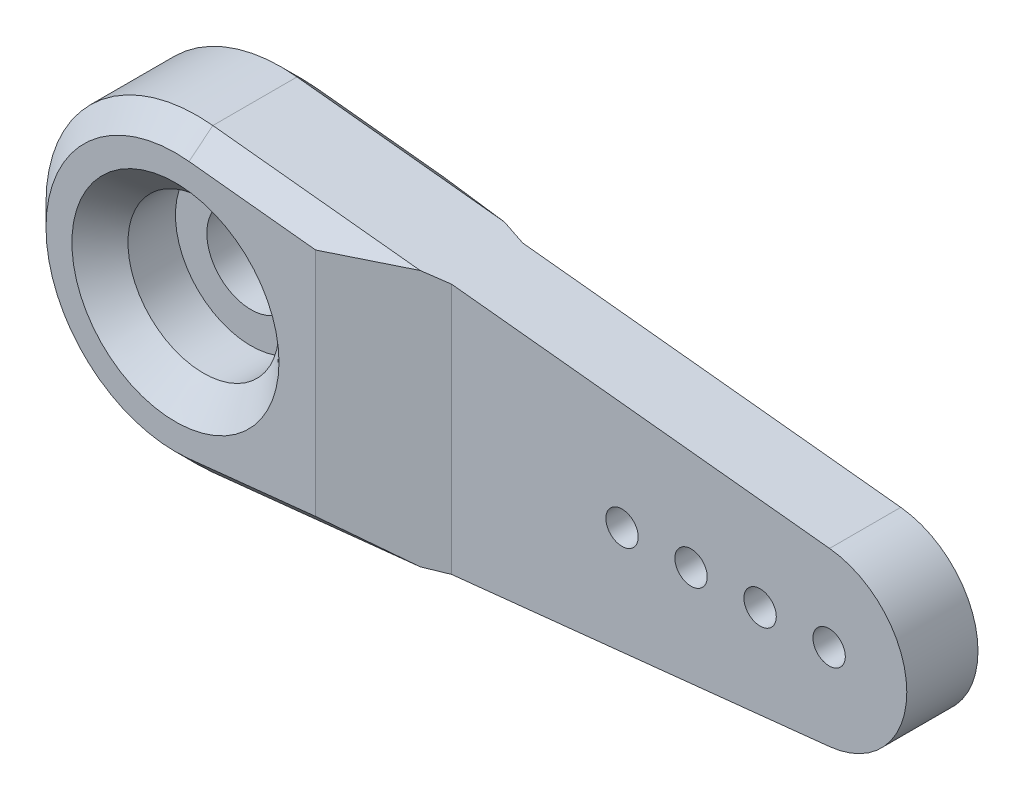
ISO-10303-21;
HEADER;
FILE_DESCRIPTION(('STEP AP214'),'2;1');
FILE_NAME('part.step','',(''),(''),'','','');
FILE_SCHEMA(('AUTOMOTIVE_DESIGN { 1 0 10303 214 1 1 1 1 }'));
ENDSEC;
DATA;
#1=APPLICATION_CONTEXT('core data for automotive mechanical design processes');
#2=APPLICATION_PROTOCOL_DEFINITION('international standard','automotive_design',2000,#1);
#3=PRODUCT_CONTEXT('',#1,'mechanical');
#4=PRODUCT('Part','Part','',(#3));
#5=PRODUCT_RELATED_PRODUCT_CATEGORY('part','',(#4));
#6=PRODUCT_DEFINITION_FORMATION('','',#4);
#7=PRODUCT_DEFINITION_CONTEXT('part definition',#1,'design');
#8=PRODUCT_DEFINITION('design','',#6,#7);
#9=PRODUCT_DEFINITION_SHAPE('','',#8);
#10=(LENGTH_UNIT() NAMED_UNIT(*) SI_UNIT(.MILLI.,.METRE.));
#11=(NAMED_UNIT(*) PLANE_ANGLE_UNIT() SI_UNIT($,.RADIAN.));
#12=(NAMED_UNIT(*) SI_UNIT($,.STERADIAN.) SOLID_ANGLE_UNIT());
#13=UNCERTAINTY_MEASURE_WITH_UNIT(LENGTH_MEASURE(1.E-05),#10,'distance_accuracy_value','');
#14=(GEOMETRIC_REPRESENTATION_CONTEXT(3) GLOBAL_UNCERTAINTY_ASSIGNED_CONTEXT((#13)) GLOBAL_UNIT_ASSIGNED_CONTEXT((#10,
#11,#12)) REPRESENTATION_CONTEXT('',''));
#15=CARTESIAN_POINT('',(0.,0.,0.));
#16=DIRECTION('',(0.,0.,1.));
#17=DIRECTION('',(1.,0.,0.));
#18=AXIS2_PLACEMENT_3D('',#15,#16,#17);
#19=CARTESIAN_POINT('',(0.,0.,3.3));
#20=DIRECTION('',(0.,0.,-1.));
#21=DIRECTION('',(-1.,0.,0.));
#22=AXIS2_PLACEMENT_3D('',#19,#20,#21);
#23=CYLINDRICAL_SURFACE('',#22,2.04677347148356);
#24=CARTESIAN_POINT('',(0.,0.,-1.3));
#25=DIRECTION('',(0.,0.,1.));
#26=DIRECTION('',(1.,0.,0.));
#27=AXIS2_PLACEMENT_3D('',#24,#25,#26);
#28=CIRCLE('',#27,2.04677347148356);
#29=CARTESIAN_POINT('',(2.04677347148356,0.,-1.3));
#30=VERTEX_POINT('',#29);
#31=EDGE_CURVE('E162',#30,#30,#28,.F.);
#32=ORIENTED_EDGE('',*,*,#31,.T.);
#33=EDGE_LOOP('',(#32));
#34=FACE_BOUND('',#33,.T.);
#35=CARTESIAN_POINT('',(0.,0.,1.1));
#36=DIRECTION('',(0.,0.,1.));
#37=DIRECTION('',(1.,0.,0.));
#38=AXIS2_PLACEMENT_3D('',#35,#36,#37);
#39=CIRCLE('',#38,2.04677347148356);
#40=CARTESIAN_POINT('',(2.04677347148356,0.,1.1));
#41=VERTEX_POINT('',#40);
#42=EDGE_CURVE('E235',#41,#41,#39,.T.);
#43=ORIENTED_EDGE('',*,*,#42,.T.);
#44=EDGE_LOOP('',(#43));
#45=FACE_BOUND('',#44,.T.);
#46=ADVANCED_FACE('F34',(#34,#45),#23,.F.);
#47=CARTESIAN_POINT('',(0.,0.,-1.3));
#48=DIRECTION('',(0.,0.,1.));
#49=DIRECTION('',(1.,0.,0.));
#50=AXIS2_PLACEMENT_3D('',#47,#48,#49);
#51=PLANE('',#50);
#52=ORIENTED_EDGE('',*,*,#31,.F.);
#53=EDGE_LOOP('',(#52));
#54=FACE_BOUND('',#53,.T.);
#55=CARTESIAN_POINT('',(0.,0.,-1.3));
#56=DIRECTION('',(0.,0.,-1.));
#57=DIRECTION('',(-1.,0.,0.));
#58=AXIS2_PLACEMENT_3D('',#55,#56,#57);
#59=CIRCLE('',#58,2.75);
#60=CARTESIAN_POINT('',(-2.75,0.,-1.3));
#61=VERTEX_POINT('',#60);
#62=EDGE_CURVE('E238',#61,#61,#59,.T.);
#63=ORIENTED_EDGE('',*,*,#62,.T.);
#64=EDGE_LOOP('',(#63));
#65=FACE_BOUND('',#64,.T.);
#66=ADVANCED_FACE('F279',(#54,#65),#51,.F.);
#67=CARTESIAN_POINT('',(0.,0.,3.3));
#68=DIRECTION('',(0.,0.,1.));
#69=DIRECTION('',(1.,0.,0.));
#70=AXIS2_PLACEMENT_3D('',#67,#68,#69);
#71=PLANE('',#70);
#72=CARTESIAN_POINT('',(25.8,0.,3.3));
#73=DIRECTION('',(0.,0.,1.));
#74=DIRECTION('',(1.,0.,0.));
#75=AXIS2_PLACEMENT_3D('',#72,#73,#74);
#76=CIRCLE('',#75,0.750000000000002);
#77=CARTESIAN_POINT('',(26.55,0.,3.3));
#78=VERTEX_POINT('',#77);
#79=EDGE_CURVE('E249',#78,#78,#76,.T.);
#80=ORIENTED_EDGE('',*,*,#79,.F.);
#81=EDGE_LOOP('',(#80));
#82=FACE_BOUND('',#81,.T.);
#83=CARTESIAN_POINT('',(22.6,0.,3.3));
#84=DIRECTION('',(0.,0.,1.));
#85=DIRECTION('',(1.,0.,0.));
#86=AXIS2_PLACEMENT_3D('',#83,#84,#85);
#87=CIRCLE('',#86,0.750000000000002);
#88=CARTESIAN_POINT('',(23.35,0.,3.3));
#89=VERTEX_POINT('',#88);
#90=EDGE_CURVE('E512',#89,#89,#87,.T.);
#91=ORIENTED_EDGE('',*,*,#90,.F.);
#92=EDGE_LOOP('',(#91));
#93=FACE_BOUND('',#92,.T.);
#94=CARTESIAN_POINT('',(19.4,0.,3.3));
#95=DIRECTION('',(0.,0.,1.));
#96=DIRECTION('',(1.,0.,0.));
#97=AXIS2_PLACEMENT_3D('',#94,#95,#96);
#98=CIRCLE('',#97,0.750000000000002);
#99=CARTESIAN_POINT('',(20.15,0.,3.3));
#100=VERTEX_POINT('',#99);
#101=EDGE_CURVE('E262',#100,#100,#98,.T.);
#102=ORIENTED_EDGE('',*,*,#101,.F.);
#103=EDGE_LOOP('',(#102));
#104=FACE_BOUND('',#103,.T.);
#105=CARTESIAN_POINT('',(29.,0.,3.3));
#106=DIRECTION('',(0.,0.,1.));
#107=DIRECTION('',(1.,0.,0.));
#108=AXIS2_PLACEMENT_3D('',#105,#106,#107);
#109=CIRCLE('',#108,0.750000000000002);
#110=CARTESIAN_POINT('',(29.75,0.,3.3));
#111=VERTEX_POINT('',#110);
#112=EDGE_CURVE('E245',#111,#111,#109,.T.);
#113=ORIENTED_EDGE('',*,*,#112,.F.);
#114=EDGE_LOOP('',(#113));
#115=FACE_BOUND('',#114,.T.);
#116=DIRECTION('',(-0.994483291447898,0.104895104895105,0.));
#117=VECTOR('',#116,1.);
#118=CARTESIAN_POINT('',(0.734265734265735,6.96138304013529,3.3));
#119=LINE('',#118,#117);
#120=CARTESIAN_POINT('',(29.0195804195804,3.9779331657916,3.3));
#121=VERTEX_POINT('',#120);
#122=CARTESIAN_POINT('',(11.4999999999999,5.82584578698258,3.3));
#123=VERTEX_POINT('',#122);
#124=EDGE_CURVE('E154',#121,#123,#119,.T.);
#125=ORIENTED_EDGE('',*,*,#124,.T.);
#126=DIRECTION('',(0.,-1.,0.));
#127=VECTOR('',#126,1.);
#128=CARTESIAN_POINT('',(11.4999999999999,-6.35323074054165,3.3));
#129=LINE('',#128,#127);
#130=CARTESIAN_POINT('',(11.4999999999999,-5.82584578698258,3.3));
#131=VERTEX_POINT('',#130);
#132=EDGE_CURVE('E134',#123,#131,#129,.T.);
#133=ORIENTED_EDGE('',*,*,#132,.T.);
#134=DIRECTION('',(0.994483291447898,0.104895104895105,0.));
#135=VECTOR('',#134,1.);
#136=CARTESIAN_POINT('',(29.0195804195804,-3.9779331657916,3.3));
#137=LINE('',#136,#135);
#138=CARTESIAN_POINT('',(29.0195804195804,-3.9779331657916,3.3));
#139=VERTEX_POINT('',#138);
#140=EDGE_CURVE('E126',#131,#139,#137,.T.);
#141=ORIENTED_EDGE('',*,*,#140,.T.);
#142=CARTESIAN_POINT('',(28.6,0.,3.3));
#143=DIRECTION('',(0.,0.,1.));
#144=DIRECTION('',(-1.,0.,0.));
#145=AXIS2_PLACEMENT_3D('',#142,#143,#144);
#146=CIRCLE('',#145,4.00000000000001);
#147=EDGE_CURVE('E131',#139,#121,#146,.T.);
#148=ORIENTED_EDGE('',*,*,#147,.T.);
#149=EDGE_LOOP('',(#125,#133,#141,#148));
#150=FACE_BOUND('',#149,.T.);
#151=ADVANCED_FACE('F129',(#82,#93,#104,#115,#150),#71,.T.);
#152=CARTESIAN_POINT('',(0.,0.,0.));
#153=DIRECTION('',(0.,0.,1.));
#154=DIRECTION('',(1.,0.,0.));
#155=AXIS2_PLACEMENT_3D('',#152,#153,#154);
#156=PLANE('',#155);
#157=CARTESIAN_POINT('',(25.8,0.,0.));
#158=DIRECTION('',(0.,0.,1.));
#159=DIRECTION('',(1.,0.,0.));
#160=AXIS2_PLACEMENT_3D('',#157,#158,#159);
#161=CIRCLE('',#160,0.750000000000002);
#162=CARTESIAN_POINT('',(26.55,0.,0.));
#163=VERTEX_POINT('',#162);
#164=EDGE_CURVE('E38',#163,#163,#161,.T.);
#165=ORIENTED_EDGE('',*,*,#164,.T.);
#166=EDGE_LOOP('',(#165));
#167=FACE_BOUND('',#166,.T.);
#168=CARTESIAN_POINT('',(22.6,0.,0.));
#169=DIRECTION('',(0.,0.,1.));
#170=DIRECTION('',(1.,0.,0.));
#171=AXIS2_PLACEMENT_3D('',#168,#169,#170);
#172=CIRCLE('',#171,0.750000000000002);
#173=CARTESIAN_POINT('',(23.35,0.,0.));
#174=VERTEX_POINT('',#173);
#175=EDGE_CURVE('E248',#174,#174,#172,.T.);
#176=ORIENTED_EDGE('',*,*,#175,.T.);
#177=EDGE_LOOP('',(#176));
#178=FACE_BOUND('',#177,.T.);
#179=CARTESIAN_POINT('',(19.4,0.,0.));
#180=DIRECTION('',(0.,0.,1.));
#181=DIRECTION('',(1.,0.,0.));
#182=AXIS2_PLACEMENT_3D('',#179,#180,#181);
#183=CIRCLE('',#182,0.750000000000002);
#184=CARTESIAN_POINT('',(20.15,0.,0.));
#185=VERTEX_POINT('',#184);
#186=EDGE_CURVE('E246',#185,#185,#183,.T.);
#187=ORIENTED_EDGE('',*,*,#186,.T.);
#188=EDGE_LOOP('',(#187));
#189=FACE_BOUND('',#188,.T.);
#190=CARTESIAN_POINT('',(29.,0.,0.));
#191=DIRECTION('',(0.,0.,1.));
#192=DIRECTION('',(1.,0.,0.));
#193=AXIS2_PLACEMENT_3D('',#190,#191,#192);
#194=CIRCLE('',#193,0.750000000000002);
#195=CARTESIAN_POINT('',(29.75,0.,0.));
#196=VERTEX_POINT('',#195);
#197=EDGE_CURVE('E242',#196,#196,#194,.T.);
#198=ORIENTED_EDGE('',*,*,#197,.T.);
#199=EDGE_LOOP('',(#198));
#200=FACE_BOUND('',#199,.T.);
#201=DIRECTION('',(0.994483291447898,0.104895104895105,0.));
#202=VECTOR('',#201,1.);
#203=CARTESIAN_POINT('',(29.0195804195804,-3.9779331657916,0.));
#204=LINE('',#203,#202);
#205=CARTESIAN_POINT('',(11.4999999999999,-5.82584578698258,0.));
#206=VERTEX_POINT('',#205);
#207=CARTESIAN_POINT('',(29.0195804195804,-3.9779331657916,0.));
#208=VERTEX_POINT('',#207);
#209=EDGE_CURVE('E145',#206,#208,#204,.T.);
#210=ORIENTED_EDGE('',*,*,#209,.F.);
#211=DIRECTION('',(0.,1.,0.));
#212=VECTOR('',#211,1.);
#213=CARTESIAN_POINT('',(11.4999999999999,0.,0.));
#214=LINE('',#213,#212);
#215=CARTESIAN_POINT('',(11.4999999999999,5.82584578698258,0.));
#216=VERTEX_POINT('',#215);
#217=EDGE_CURVE('E175',#206,#216,#214,.T.);
#218=ORIENTED_EDGE('',*,*,#217,.T.);
#219=DIRECTION('',(-0.994483291447898,0.104895104895105,0.));
#220=VECTOR('',#219,1.);
#221=CARTESIAN_POINT('',(0.734265734265735,6.96138304013529,0.));
#222=LINE('',#221,#220);
#223=CARTESIAN_POINT('',(29.0195804195804,3.9779331657916,0.));
#224=VERTEX_POINT('',#223);
#225=EDGE_CURVE('E138',#224,#216,#222,.T.);
#226=ORIENTED_EDGE('',*,*,#225,.F.);
#227=CARTESIAN_POINT('',(28.6,0.,0.));
#228=DIRECTION('',(0.,0.,1.));
#229=DIRECTION('',(-1.,0.,0.));
#230=AXIS2_PLACEMENT_3D('',#227,#228,#229);
#231=CIRCLE('',#230,4.00000000000001);
#232=EDGE_CURVE('E161',#208,#224,#231,.T.);
#233=ORIENTED_EDGE('',*,*,#232,.F.);
#234=EDGE_LOOP('',(#210,#218,#226,#233));
#235=FACE_BOUND('',#234,.T.);
#236=ADVANCED_FACE('F311',(#167,#178,#189,#200,#235),#156,.F.);
#237=CARTESIAN_POINT('',(0.,0.,3.3));
#238=DIRECTION('',(0.,0.,-1.));
#239=DIRECTION('',(-1.,0.,0.));
#240=AXIS2_PLACEMENT_3D('',#237,#238,#239);
#241=CYLINDRICAL_SURFACE('',#240,7.00000000000001);
#242=DIRECTION('',(0.,0.,-1.));
#243=VECTOR('',#242,1.);
#244=CARTESIAN_POINT('',(0.734265734265735,6.96138304013529,3.3));
#245=LINE('',#244,#243);
#246=CARTESIAN_POINT('',(0.734265734265735,6.96138304013529,3.59999999999999));
#247=VERTEX_POINT('',#246);
#248=CARTESIAN_POINT('',(0.734265734265735,6.96138304013529,-0.300000000000001));
#249=VERTEX_POINT('',#248);
#250=EDGE_CURVE('E156',#247,#249,#245,.T.);
#251=ORIENTED_EDGE('',*,*,#250,.T.);
#252=CARTESIAN_POINT('',(0.,0.,-0.300000000000001));
#253=DIRECTION('',(0.,0.,1.));
#254=DIRECTION('',(1.,0.,0.));
#255=AXIS2_PLACEMENT_3D('',#252,#253,#254);
#256=CIRCLE('',#255,7.00000000000001);
#257=CARTESIAN_POINT('',(0.734265734265736,-6.96138304013529,-0.300000000000001));
#258=VERTEX_POINT('',#257);
#259=EDGE_CURVE('E204',#249,#258,#256,.T.);
#260=ORIENTED_EDGE('',*,*,#259,.T.);
#261=DIRECTION('',(0.,0.,-1.));
#262=VECTOR('',#261,1.);
#263=CARTESIAN_POINT('',(0.734265734265736,-6.96138304013529,3.3));
#264=LINE('',#263,#262);
#265=CARTESIAN_POINT('',(0.734265734265736,-6.96138304013529,3.59999999999999));
#266=VERTEX_POINT('',#265);
#267=EDGE_CURVE('E148',#266,#258,#264,.T.);
#268=ORIENTED_EDGE('',*,*,#267,.F.);
#269=CARTESIAN_POINT('',(0.,0.,3.59999999999999));
#270=DIRECTION('',(0.,0.,1.));
#271=DIRECTION('',(1.,0.,0.));
#272=AXIS2_PLACEMENT_3D('',#269,#270,#271);
#273=CIRCLE('',#272,7.00000000000001);
#274=EDGE_CURVE('E202',#266,#247,#273,.F.);
#275=ORIENTED_EDGE('',*,*,#274,.T.);
#276=EDGE_LOOP('',(#251,#260,#268,#275));
#277=FACE_BOUND('',#276,.T.);
#278=ADVANCED_FACE('F315',(#277),#241,.T.);
#279=CARTESIAN_POINT('',(29.0195804195804,-3.9779331657916,3.3));
#280=DIRECTION('',(-0.104895104895105,0.994483291447898,0.));
#281=DIRECTION('',(-0.994483291447898,-0.104895104895105,0.));
#282=AXIS2_PLACEMENT_3D('',#279,#280,#281);
#283=PLANE('',#282);
#284=ORIENTED_EDGE('',*,*,#267,.T.);
#285=DIRECTION('',(0.994483291447898,0.104895104895105,0.));
#286=VECTOR('',#285,1.);
#287=CARTESIAN_POINT('',(29.0195804195804,-3.9779331657916,-0.300000000000001));
#288=LINE('',#287,#286);
#289=CARTESIAN_POINT('',(10.3461538461538,-5.94755000703467,-0.3));
#290=VERTEX_POINT('',#289);
#291=EDGE_CURVE('E192',#258,#290,#288,.T.);
#292=ORIENTED_EDGE('',*,*,#291,.T.);
#293=DIRECTION('',(0.96281877058011,0.101555226521639,0.250332880350831));
#294=VECTOR('',#293,1.);
#295=CARTESIAN_POINT('',(28.7170718870995,-4.00984085546233,4.47643869064594));
#296=LINE('',#295,#294);
#297=EDGE_CURVE('E181',#290,#206,#296,.T.);
#298=ORIENTED_EDGE('',*,*,#297,.T.);
#299=ORIENTED_EDGE('',*,*,#209,.T.);
#300=DIRECTION('',(0.,0.,-1.));
#301=VECTOR('',#300,1.);
#302=CARTESIAN_POINT('',(29.0195804195804,-3.9779331657916,3.3));
#303=LINE('',#302,#301);
#304=EDGE_CURVE('E141',#139,#208,#303,.T.);
#305=ORIENTED_EDGE('',*,*,#304,.F.);
#306=ORIENTED_EDGE('',*,*,#140,.F.);
#307=DIRECTION('',(0.96281877058011,0.101555226521639,-0.250332880350832));
#308=VECTOR('',#307,1.);
#309=CARTESIAN_POINT('',(27.9216887399855,-4.09373547628282,-0.96963907239629));
#310=LINE('',#309,#308);
#311=CARTESIAN_POINT('',(10.3461538461538,-5.94755000703467,3.6));
#312=VERTEX_POINT('',#311);
#313=EDGE_CURVE('E173',#131,#312,#310,.F.);
#314=ORIENTED_EDGE('',*,*,#313,.T.);
#315=DIRECTION('',(-0.994483291447898,-0.104895104895105,0.));
#316=VECTOR('',#315,1.);
#317=CARTESIAN_POINT('',(0.734265734265735,-6.96138304013529,3.59999999999999));
#318=LINE('',#317,#316);
#319=EDGE_CURVE('E190',#312,#266,#318,.T.);
#320=ORIENTED_EDGE('',*,*,#319,.T.);
#321=EDGE_LOOP('',(#284,#292,#298,#299,#305,#306,#314,#320));
#322=FACE_BOUND('',#321,.T.);
#323=ADVANCED_FACE('F143',(#322),#283,.F.);
#324=CARTESIAN_POINT('',(28.6,0.,3.3));
#325=DIRECTION('',(0.,0.,-1.));
#326=DIRECTION('',(-1.,0.,0.));
#327=AXIS2_PLACEMENT_3D('',#324,#325,#326);
#328=CYLINDRICAL_SURFACE('',#327,4.00000000000001);
#329=ORIENTED_EDGE('',*,*,#232,.T.);
#330=DIRECTION('',(0.,0.,-1.));
#331=VECTOR('',#330,1.);
#332=CARTESIAN_POINT('',(29.0195804195804,3.9779331657916,3.3));
#333=LINE('',#332,#331);
#334=EDGE_CURVE('E149',#121,#224,#333,.T.);
#335=ORIENTED_EDGE('',*,*,#334,.F.);
#336=ORIENTED_EDGE('',*,*,#147,.F.);
#337=ORIENTED_EDGE('',*,*,#304,.T.);
#338=EDGE_LOOP('',(#329,#335,#336,#337));
#339=FACE_BOUND('',#338,.T.);
#340=ADVANCED_FACE('F151',(#339),#328,.T.);
#341=CARTESIAN_POINT('',(0.734265734265735,6.96138304013529,3.3));
#342=DIRECTION('',(-0.104895104895105,-0.994483291447898,0.));
#343=DIRECTION('',(0.994483291447898,-0.104895104895105,0.));
#344=AXIS2_PLACEMENT_3D('',#341,#342,#343);
#345=PLANE('',#344);
#346=DIRECTION('',(-0.96281877058011,0.101555226521639,-0.250332880350831));
#347=VECTOR('',#346,1.);
#348=CARTESIAN_POINT('',(2.20430031663161,6.80632821614504,-2.41688191767579));
#349=LINE('',#348,#347);
#350=CARTESIAN_POINT('',(10.3461538461538,5.94755000703468,-0.300000000000001));
#351=VERTEX_POINT('',#350);
#352=EDGE_CURVE('E178',#216,#351,#349,.T.);
#353=ORIENTED_EDGE('',*,*,#352,.T.);
#354=DIRECTION('',(-0.994483291447898,0.104895104895105,0.));
#355=VECTOR('',#354,1.);
#356=CARTESIAN_POINT('',(0.734265734265735,6.96138304013529,-0.300000000000001));
#357=LINE('',#356,#355);
#358=EDGE_CURVE('E200',#351,#249,#357,.T.);
#359=ORIENTED_EDGE('',*,*,#358,.T.);
#360=ORIENTED_EDGE('',*,*,#250,.F.);
#361=DIRECTION('',(0.994483291447898,-0.104895104895105,0.));
#362=VECTOR('',#361,1.);
#363=CARTESIAN_POINT('',(6.5,6.35323074054165,3.59999999999999));
#364=LINE('',#363,#362);
#365=CARTESIAN_POINT('',(10.3461538461538,5.94755000703467,3.59999999999999));
#366=VERTEX_POINT('',#365);
#367=EDGE_CURVE('E198',#247,#366,#364,.T.);
#368=ORIENTED_EDGE('',*,*,#367,.T.);
#369=DIRECTION('',(-0.96281877058011,0.101555226521639,0.250332880350832));
#370=VECTOR('',#369,1.);
#371=CARTESIAN_POINT('',(1.40891716951757,6.89022283696552,5.92368153592544));
#372=LINE('',#371,#370);
#373=EDGE_CURVE('E171',#366,#123,#372,.F.);
#374=ORIENTED_EDGE('',*,*,#373,.T.);
#375=ORIENTED_EDGE('',*,*,#124,.F.);
#376=ORIENTED_EDGE('',*,*,#334,.T.);
#377=ORIENTED_EDGE('',*,*,#225,.T.);
#378=EDGE_LOOP('',(#353,#359,#360,#368,#374,#375,#376,#377));
#379=FACE_BOUND('',#378,.T.);
#380=ADVANCED_FACE('F316',(#379),#345,.F.);
#381=CARTESIAN_POINT('',(0.,0.,-1.3));
#382=DIRECTION('',(0.,0.,1.));
#383=DIRECTION('',(1.,0.,0.));
#384=AXIS2_PLACEMENT_3D('',#381,#382,#383);
#385=CIRCLE('',#384,5.5);
#386=CARTESIAN_POINT('',(5.5,0.,-1.3));
#387=VERTEX_POINT('',#386);
#388=EDGE_CURVE('E215',#387,#387,#385,.F.);
#389=ORIENTED_EDGE('',*,*,#388,.F.);
#390=EDGE_LOOP('',(#389));
#391=FACE_BOUND('',#390,.T.);
#392=DIRECTION('',(0.,-1.,0.));
#393=VECTOR('',#392,1.);
#394=CARTESIAN_POINT('',(6.5,6.35323074054165,-1.3));
#395=LINE('',#394,#393);
#396=CARTESIAN_POINT('',(6.5,5.34768342908901,-1.3));
#397=VERTEX_POINT('',#396);
#398=CARTESIAN_POINT('',(6.5,-5.34768342908901,-1.3));
#399=VERTEX_POINT('',#398);
#400=EDGE_CURVE('E272',#397,#399,#395,.T.);
#401=ORIENTED_EDGE('',*,*,#400,.T.);
#402=DIRECTION('',(-0.994483291447898,-0.104895104895105,0.));
#403=VECTOR('',#402,1.);
#404=CARTESIAN_POINT('',(0.629370629370629,-5.96689974868739,-1.3));
#405=LINE('',#404,#403);
#406=CARTESIAN_POINT('',(0.629370629370631,-5.96689974868739,-1.3));
#407=VERTEX_POINT('',#406);
#408=EDGE_CURVE('E187',#399,#407,#405,.T.);
#409=ORIENTED_EDGE('',*,*,#408,.T.);
#410=CARTESIAN_POINT('',(0.,0.,-1.3));
#411=DIRECTION('',(0.,0.,1.));
#412=DIRECTION('',(1.,0.,0.));
#413=AXIS2_PLACEMENT_3D('',#410,#411,#412);
#414=CIRCLE('',#413,6.00000000000001);
#415=CARTESIAN_POINT('',(0.62937062937063,5.96689974868739,-1.3));
#416=VERTEX_POINT('',#415);
#417=EDGE_CURVE('E183',#407,#416,#414,.F.);
#418=ORIENTED_EDGE('',*,*,#417,.T.);
#419=DIRECTION('',(0.994483291447898,-0.104895104895105,0.));
#420=VECTOR('',#419,1.);
#421=CARTESIAN_POINT('',(0.62937062937063,5.96689974868739,-1.3));
#422=LINE('',#421,#420);
#423=EDGE_CURVE('E185',#416,#397,#422,.T.);
#424=ORIENTED_EDGE('',*,*,#423,.T.);
#425=EDGE_LOOP('',(#401,#409,#418,#424));
#426=FACE_BOUND('',#425,.T.);
#427=ADVANCED_FACE('F283',(#391,#426),#51,.F.);
#428=CARTESIAN_POINT('',(0.,0.,4.6));
#429=DIRECTION('',(0.,0.,1.));
#430=DIRECTION('',(1.,0.,0.));
#431=AXIS2_PLACEMENT_3D('',#428,#429,#430);
#432=PLANE('',#431);
#433=CARTESIAN_POINT('',(0.,0.,4.6));
#434=DIRECTION('',(0.,0.,1.));
#435=DIRECTION('',(1.,0.,0.));
#436=AXIS2_PLACEMENT_3D('',#433,#434,#435);
#437=CIRCLE('',#436,4.8);
#438=CARTESIAN_POINT('',(4.8,0.,4.6));
#439=VERTEX_POINT('',#438);
#440=EDGE_CURVE('E12',#439,#439,#437,.F.);
#441=ORIENTED_EDGE('',*,*,#440,.T.);
#442=EDGE_LOOP('',(#441));
#443=FACE_BOUND('',#442,.T.);
#444=DIRECTION('',(0.,1.,0.));
#445=VECTOR('',#444,1.);
#446=CARTESIAN_POINT('',(6.5,6.35323074054165,4.6));
#447=LINE('',#446,#445);
#448=CARTESIAN_POINT('',(6.5,-5.347683429089,4.6));
#449=VERTEX_POINT('',#448);
#450=CARTESIAN_POINT('',(6.5,5.34768342908901,4.6));
#451=VERTEX_POINT('',#450);
#452=EDGE_CURVE('E222',#449,#451,#447,.T.);
#453=ORIENTED_EDGE('',*,*,#452,.T.);
#454=DIRECTION('',(-0.994483291447898,0.104895104895105,0.));
#455=VECTOR('',#454,1.);
#456=CARTESIAN_POINT('',(0.629370629370629,5.96689974868739,4.6));
#457=LINE('',#456,#455);
#458=CARTESIAN_POINT('',(0.629370629370629,5.96689974868739,4.6));
#459=VERTEX_POINT('',#458);
#460=EDGE_CURVE('E209',#451,#459,#457,.T.);
#461=ORIENTED_EDGE('',*,*,#460,.T.);
#462=CARTESIAN_POINT('',(0.,0.,4.6));
#463=DIRECTION('',(0.,0.,1.));
#464=DIRECTION('',(1.,0.,0.));
#465=AXIS2_PLACEMENT_3D('',#462,#463,#464);
#466=CIRCLE('',#465,6.);
#467=CARTESIAN_POINT('',(0.62937062937063,-5.96689974868739,4.6));
#468=VERTEX_POINT('',#467);
#469=EDGE_CURVE('E51',#459,#468,#466,.T.);
#470=ORIENTED_EDGE('',*,*,#469,.T.);
#471=DIRECTION('',(0.994483291447898,0.104895104895105,0.));
#472=VECTOR('',#471,1.);
#473=CARTESIAN_POINT('',(6.39510489510489,-5.35874744909374,4.6));
#474=LINE('',#473,#472);
#475=EDGE_CURVE('E207',#468,#449,#474,.T.);
#476=ORIENTED_EDGE('',*,*,#475,.T.);
#477=EDGE_LOOP('',(#453,#461,#470,#476));
#478=FACE_BOUND('',#477,.T.);
#479=ADVANCED_FACE('F331',(#443,#478),#432,.T.);
#480=CARTESIAN_POINT('',(6.5,6.35323074054165,4.6));
#481=DIRECTION('',(0.251633851764953,0.,0.967822506788271));
#482=DIRECTION('',(0.,-1.,0.));
#483=AXIS2_PLACEMENT_3D('',#480,#481,#482);
#484=PLANE('',#483);
#485=ORIENTED_EDGE('',*,*,#373,.F.);
#486=DIRECTION('',(0.956981538878809,0.149255922629947,-0.248815200108493));
#487=VECTOR('',#486,1.);
#488=CARTESIAN_POINT('',(1.21204325944389,4.52294561537566,5.9748687525446));
#489=LINE('',#488,#487);
#490=EDGE_CURVE('E213',#366,#451,#489,.F.);
#491=ORIENTED_EDGE('',*,*,#490,.T.);
#492=ORIENTED_EDGE('',*,*,#452,.F.);
#493=DIRECTION('',(-0.956981538878809,0.149255922629947,0.248815200108493));
#494=VECTOR('',#493,1.);
#495=CARTESIAN_POINT('',(1.21204325944389,-4.52294561537565,5.9748687525446));
#496=LINE('',#495,#494);
#497=EDGE_CURVE('E211',#449,#312,#496,.F.);
#498=ORIENTED_EDGE('',*,*,#497,.T.);
#499=ORIENTED_EDGE('',*,*,#313,.F.);
#500=ORIENTED_EDGE('',*,*,#132,.F.);
#501=EDGE_LOOP('',(#485,#491,#492,#498,#499,#500));
#502=FACE_BOUND('',#501,.T.);
#503=ADVANCED_FACE('F327',(#502),#484,.T.);
#504=CARTESIAN_POINT('',(11.4999999999999,0.,0.));
#505=DIRECTION('',(-0.251633851764953,0.,0.967822506788271));
#506=DIRECTION('',(0.,1.,0.));
#507=AXIS2_PLACEMENT_3D('',#504,#505,#506);
#508=PLANE('',#507);
#509=ORIENTED_EDGE('',*,*,#297,.F.);
#510=DIRECTION('',(0.956981538878809,-0.149255922629947,0.248815200108493));
#511=VECTOR('',#510,1.);
#512=CARTESIAN_POINT('',(1.21204325944388,-4.52294561537566,-2.6748687525446));
#513=LINE('',#512,#511);
#514=EDGE_CURVE('E196',#290,#399,#513,.F.);
#515=ORIENTED_EDGE('',*,*,#514,.T.);
#516=ORIENTED_EDGE('',*,*,#400,.F.);
#517=DIRECTION('',(-0.956981538878809,-0.149255922629947,-0.248815200108493));
#518=VECTOR('',#517,1.);
#519=CARTESIAN_POINT('',(1.21204325944388,4.52294561537567,-2.6748687525446));
#520=LINE('',#519,#518);
#521=EDGE_CURVE('E194',#397,#351,#520,.F.);
#522=ORIENTED_EDGE('',*,*,#521,.T.);
#523=ORIENTED_EDGE('',*,*,#352,.F.);
#524=ORIENTED_EDGE('',*,*,#217,.F.);
#525=EDGE_LOOP('',(#509,#515,#516,#522,#523,#524));
#526=FACE_BOUND('',#525,.T.);
#527=ADVANCED_FACE('F330',(#526),#508,.F.);
#528=CARTESIAN_POINT('',(0.62937062937063,5.96689974868739,-1.3));
#529=DIRECTION('',(-0.0741720399846028,-0.703205879159525,0.707106781186549));
#530=DIRECTION('',(0.994483291447898,-0.104895104895105,0.));
#531=AXIS2_PLACEMENT_3D('',#528,#529,#530);
#532=PLANE('',#531);
#533=ORIENTED_EDGE('',*,*,#521,.F.);
#534=ORIENTED_EDGE('',*,*,#423,.F.);
#535=DIRECTION('',(-0.0741720399846031,-0.703205879159528,-0.707106781186546));
#536=VECTOR('',#535,1.);
#537=CARTESIAN_POINT('',(0.734265734265735,6.96138304013529,-0.300000000000001));
#538=LINE('',#537,#536);
#539=EDGE_CURVE('E218',#249,#416,#538,.T.);
#540=ORIENTED_EDGE('',*,*,#539,.F.);
#541=ORIENTED_EDGE('',*,*,#358,.F.);
#542=EDGE_LOOP('',(#533,#534,#540,#541));
#543=FACE_BOUND('',#542,.T.);
#544=ADVANCED_FACE('F335',(#543),#532,.F.);
#545=CARTESIAN_POINT('',(0.,0.,-1.3));
#546=DIRECTION('',(0.,0.,1.));
#547=DIRECTION('',(1.,0.,0.));
#548=AXIS2_PLACEMENT_3D('',#545,#546,#547);
#549=CONICAL_SURFACE('',#548,6.00000000000001,0.78539816339745);
#550=ORIENTED_EDGE('',*,*,#539,.T.);
#551=ORIENTED_EDGE('',*,*,#417,.F.);
#552=DIRECTION('',(-0.074172039984603,0.703205879159528,-0.707106781186546));
#553=VECTOR('',#552,1.);
#554=CARTESIAN_POINT('',(0.734265734265736,-6.96138304013529,-0.300000000000001));
#555=LINE('',#554,#553);
#556=EDGE_CURVE('E216',#258,#407,#555,.T.);
#557=ORIENTED_EDGE('',*,*,#556,.F.);
#558=ORIENTED_EDGE('',*,*,#259,.F.);
#559=EDGE_LOOP('',(#550,#551,#557,#558));
#560=FACE_BOUND('',#559,.T.);
#561=ADVANCED_FACE('F341',(#560),#549,.T.);
#562=CARTESIAN_POINT('',(0.629370629370629,-5.96689974868739,-1.3));
#563=DIRECTION('',(-0.0741720399846027,0.703205879159525,0.707106781186549));
#564=DIRECTION('',(-0.994483291447898,-0.104895104895105,0.));
#565=AXIS2_PLACEMENT_3D('',#562,#563,#564);
#566=PLANE('',#565);
#567=ORIENTED_EDGE('',*,*,#514,.F.);
#568=ORIENTED_EDGE('',*,*,#291,.F.);
#569=ORIENTED_EDGE('',*,*,#556,.T.);
#570=ORIENTED_EDGE('',*,*,#408,.F.);
#571=EDGE_LOOP('',(#567,#568,#569,#570));
#572=FACE_BOUND('',#571,.T.);
#573=ADVANCED_FACE('F337',(#572),#566,.F.);
#574=CARTESIAN_POINT('',(0.629370629370628,-5.96689974868738,4.6));
#575=DIRECTION('',(0.0741720399846026,-0.703205879159525,0.707106781186549));
#576=DIRECTION('',(-0.994483291447898,-0.104895104895105,0.));
#577=AXIS2_PLACEMENT_3D('',#574,#575,#576);
#578=PLANE('',#577);
#579=ORIENTED_EDGE('',*,*,#497,.F.);
#580=ORIENTED_EDGE('',*,*,#475,.F.);
#581=DIRECTION('',(-0.0741720399846031,0.703205879159528,0.707106781186546));
#582=VECTOR('',#581,1.);
#583=CARTESIAN_POINT('',(0.734265734265736,-6.96138304013529,3.59999999999999));
#584=LINE('',#583,#582);
#585=EDGE_CURVE('E219',#266,#468,#584,.T.);
#586=ORIENTED_EDGE('',*,*,#585,.F.);
#587=ORIENTED_EDGE('',*,*,#319,.F.);
#588=EDGE_LOOP('',(#579,#580,#586,#587));
#589=FACE_BOUND('',#588,.T.);
#590=ADVANCED_FACE('F340',(#589),#578,.T.);
#591=CARTESIAN_POINT('',(0.,0.,4.6));
#592=DIRECTION('',(0.,0.,-1.));
#593=DIRECTION('',(-1.,0.,0.));
#594=AXIS2_PLACEMENT_3D('',#591,#592,#593);
#595=CONICAL_SURFACE('',#594,6.,0.78539816339745);
#596=ORIENTED_EDGE('',*,*,#585,.T.);
#597=ORIENTED_EDGE('',*,*,#469,.F.);
#598=DIRECTION('',(-0.0741720399846031,-0.703205879159528,0.707106781186546));
#599=VECTOR('',#598,1.);
#600=CARTESIAN_POINT('',(0.734265734265735,6.96138304013529,3.59999999999999));
#601=LINE('',#600,#599);
#602=EDGE_CURVE('E59',#247,#459,#601,.T.);
#603=ORIENTED_EDGE('',*,*,#602,.F.);
#604=ORIENTED_EDGE('',*,*,#274,.F.);
#605=EDGE_LOOP('',(#596,#597,#603,#604));
#606=FACE_BOUND('',#605,.T.);
#607=ADVANCED_FACE('F352',(#606),#595,.T.);
#608=CARTESIAN_POINT('',(0.62937062937063,5.96689974868739,4.6));
#609=DIRECTION('',(0.0741720399846028,0.703205879159525,0.707106781186549));
#610=DIRECTION('',(0.994483291447898,-0.104895104895105,0.));
#611=AXIS2_PLACEMENT_3D('',#608,#609,#610);
#612=PLANE('',#611);
#613=ORIENTED_EDGE('',*,*,#490,.F.);
#614=ORIENTED_EDGE('',*,*,#367,.F.);
#615=ORIENTED_EDGE('',*,*,#602,.T.);
#616=ORIENTED_EDGE('',*,*,#460,.F.);
#617=EDGE_LOOP('',(#613,#614,#615,#616));
#618=FACE_BOUND('',#617,.T.);
#619=ADVANCED_FACE('F349',(#618),#612,.T.);
#620=CARTESIAN_POINT('',(0.,0.,-3.1));
#621=DIRECTION('',(0.,0.,-1.));
#622=DIRECTION('',(-1.,0.,0.));
#623=AXIS2_PLACEMENT_3D('',#620,#621,#622);
#624=PLANE('',#623);
#625=CARTESIAN_POINT('',(0.,0.,-3.1));
#626=DIRECTION('',(0.,0.,-1.));
#627=DIRECTION('',(-1.,0.,0.));
#628=AXIS2_PLACEMENT_3D('',#625,#626,#627);
#629=CIRCLE('',#628,4.);
#630=CARTESIAN_POINT('',(-4.,0.,-3.1));
#631=VERTEX_POINT('',#630);
#632=EDGE_CURVE('E229',#631,#631,#629,.T.);
#633=ORIENTED_EDGE('',*,*,#632,.T.);
#634=EDGE_LOOP('',(#633));
#635=FACE_BOUND('',#634,.T.);
#636=CARTESIAN_POINT('',(0.,0.,-3.1));
#637=DIRECTION('',(0.,0.,-1.));
#638=DIRECTION('',(-1.,0.,0.));
#639=AXIS2_PLACEMENT_3D('',#636,#637,#638);
#640=CIRCLE('',#639,2.75);
#641=CARTESIAN_POINT('',(-2.75,0.,-3.1));
#642=VERTEX_POINT('',#641);
#643=EDGE_CURVE('E224',#642,#642,#640,.T.);
#644=ORIENTED_EDGE('',*,*,#643,.F.);
#645=EDGE_LOOP('',(#644));
#646=FACE_BOUND('',#645,.T.);
#647=ADVANCED_FACE('F298',(#635,#646),#624,.T.);
#648=CARTESIAN_POINT('',(0.,0.,-3.1));
#649=DIRECTION('',(0.,0.,1.));
#650=DIRECTION('',(1.,0.,0.));
#651=AXIS2_PLACEMENT_3D('',#648,#649,#650);
#652=CYLINDRICAL_SURFACE('',#651,5.5);
#653=CARTESIAN_POINT('',(0.,0.,-1.59999999999999));
#654=DIRECTION('',(0.,0.,-1.));
#655=DIRECTION('',(-1.,0.,0.));
#656=AXIS2_PLACEMENT_3D('',#653,#654,#655);
#657=CIRCLE('',#656,5.5);
#658=CARTESIAN_POINT('',(-5.5,0.,-1.59999999999999));
#659=VERTEX_POINT('',#658);
#660=EDGE_CURVE('E232',#659,#659,#657,.F.);
#661=ORIENTED_EDGE('',*,*,#660,.T.);
#662=EDGE_LOOP('',(#661));
#663=FACE_BOUND('',#662,.T.);
#664=ORIENTED_EDGE('',*,*,#388,.T.);
#665=EDGE_LOOP('',(#664));
#666=FACE_BOUND('',#665,.T.);
#667=ADVANCED_FACE('F289',(#663,#666),#652,.T.);
#668=CARTESIAN_POINT('',(0.,0.,-3.1));
#669=DIRECTION('',(0.,0.,1.));
#670=DIRECTION('',(1.,0.,0.));
#671=AXIS2_PLACEMENT_3D('',#668,#669,#670);
#672=CYLINDRICAL_SURFACE('',#671,2.75);
#673=ORIENTED_EDGE('',*,*,#643,.T.);
#674=EDGE_LOOP('',(#673));
#675=FACE_BOUND('',#674,.T.);
#676=ORIENTED_EDGE('',*,*,#62,.F.);
#677=EDGE_LOOP('',(#676));
#678=FACE_BOUND('',#677,.T.);
#679=ADVANCED_FACE('F286',(#675,#678),#672,.F.);
#680=CARTESIAN_POINT('',(0.,0.,-3.1));
#681=DIRECTION('',(0.,0.,1.));
#682=DIRECTION('',(1.,0.,0.));
#683=AXIS2_PLACEMENT_3D('',#680,#681,#682);
#684=CONICAL_SURFACE('',#683,4.,0.785398163397447);
#685=ORIENTED_EDGE('',*,*,#660,.F.);
#686=EDGE_LOOP('',(#685));
#687=FACE_BOUND('',#686,.T.);
#688=ORIENTED_EDGE('',*,*,#632,.F.);
#689=EDGE_LOOP('',(#688));
#690=FACE_BOUND('',#689,.T.);
#691=ADVANCED_FACE('F288',(#687,#690),#684,.T.);
#692=CARTESIAN_POINT('',(0.,0.,1.1));
#693=DIRECTION('',(0.,0.,1.));
#694=DIRECTION('',(1.,0.,0.));
#695=AXIS2_PLACEMENT_3D('',#692,#693,#694);
#696=CYLINDRICAL_SURFACE('',#695,3.5);
#697=CARTESIAN_POINT('',(0.,0.,3.3));
#698=DIRECTION('',(0.,0.,1.));
#699=DIRECTION('',(1.,0.,0.));
#700=AXIS2_PLACEMENT_3D('',#697,#698,#699);
#701=CIRCLE('',#700,3.5);
#702=CARTESIAN_POINT('',(3.5,0.,3.3));
#703=VERTEX_POINT('',#702);
#704=EDGE_CURVE('E43',#703,#703,#701,.T.);
#705=ORIENTED_EDGE('',*,*,#704,.T.);
#706=EDGE_LOOP('',(#705));
#707=FACE_BOUND('',#706,.T.);
#708=CARTESIAN_POINT('',(0.,0.,1.1));
#709=DIRECTION('',(0.,0.,1.));
#710=DIRECTION('',(1.,0.,0.));
#711=AXIS2_PLACEMENT_3D('',#708,#709,#710);
#712=CIRCLE('',#711,3.5);
#713=CARTESIAN_POINT('',(3.5,0.,1.1));
#714=VERTEX_POINT('',#713);
#715=EDGE_CURVE('E239',#714,#714,#712,.T.);
#716=ORIENTED_EDGE('',*,*,#715,.F.);
#717=EDGE_LOOP('',(#716));
#718=FACE_BOUND('',#717,.T.);
#719=ADVANCED_FACE('F296',(#707,#718),#696,.F.);
#720=CARTESIAN_POINT('',(0.,0.,1.1));
#721=DIRECTION('',(0.,0.,1.));
#722=DIRECTION('',(1.,0.,0.));
#723=AXIS2_PLACEMENT_3D('',#720,#721,#722);
#724=PLANE('',#723);
#725=ORIENTED_EDGE('',*,*,#42,.F.);
#726=EDGE_LOOP('',(#725));
#727=FACE_BOUND('',#726,.T.);
#728=ORIENTED_EDGE('',*,*,#715,.T.);
#729=EDGE_LOOP('',(#728));
#730=FACE_BOUND('',#729,.T.);
#731=ADVANCED_FACE('F428',(#727,#730),#724,.T.);
#732=CARTESIAN_POINT('',(0.,0.,3.3));
#733=DIRECTION('',(0.,0.,1.));
#734=DIRECTION('',(1.,0.,0.));
#735=AXIS2_PLACEMENT_3D('',#732,#733,#734);
#736=CONICAL_SURFACE('',#735,3.5,0.785398163397448);
#737=ORIENTED_EDGE('',*,*,#440,.F.);
#738=EDGE_LOOP('',(#737));
#739=FACE_BOUND('',#738,.T.);
#740=ORIENTED_EDGE('',*,*,#704,.F.);
#741=EDGE_LOOP('',(#740));
#742=FACE_BOUND('',#741,.T.);
#743=ADVANCED_FACE('F36',(#739,#742),#736,.F.);
#744=CARTESIAN_POINT('',(29.,0.,-0.2));
#745=DIRECTION('',(0.,0.,1.));
#746=DIRECTION('',(1.,0.,0.));
#747=AXIS2_PLACEMENT_3D('',#744,#745,#746);
#748=CYLINDRICAL_SURFACE('',#747,0.750000000000002);
#749=ORIENTED_EDGE('',*,*,#112,.T.);
#750=EDGE_LOOP('',(#749));
#751=FACE_BOUND('',#750,.T.);
#752=ORIENTED_EDGE('',*,*,#197,.F.);
#753=EDGE_LOOP('',(#752));
#754=FACE_BOUND('',#753,.T.);
#755=ADVANCED_FACE('F454',(#751,#754),#748,.F.);
#756=CARTESIAN_POINT('',(19.4,0.,-0.2));
#757=DIRECTION('',(0.,0.,1.));
#758=DIRECTION('',(1.,0.,0.));
#759=AXIS2_PLACEMENT_3D('',#756,#757,#758);
#760=CYLINDRICAL_SURFACE('',#759,0.750000000000002);
#761=ORIENTED_EDGE('',*,*,#101,.T.);
#762=EDGE_LOOP('',(#761));
#763=FACE_BOUND('',#762,.T.);
#764=ORIENTED_EDGE('',*,*,#186,.F.);
#765=EDGE_LOOP('',(#764));
#766=FACE_BOUND('',#765,.T.);
#767=ADVANCED_FACE('F476',(#763,#766),#760,.F.);
#768=CARTESIAN_POINT('',(22.6,0.,-0.2));
#769=DIRECTION('',(0.,0.,1.));
#770=DIRECTION('',(1.,0.,0.));
#771=AXIS2_PLACEMENT_3D('',#768,#769,#770);
#772=CYLINDRICAL_SURFACE('',#771,0.750000000000002);
#773=ORIENTED_EDGE('',*,*,#90,.T.);
#774=EDGE_LOOP('',(#773));
#775=FACE_BOUND('',#774,.T.);
#776=ORIENTED_EDGE('',*,*,#175,.F.);
#777=EDGE_LOOP('',(#776));
#778=FACE_BOUND('',#777,.T.);
#779=ADVANCED_FACE('F485',(#775,#778),#772,.F.);
#780=CARTESIAN_POINT('',(25.8,0.,-0.2));
#781=DIRECTION('',(0.,0.,1.));
#782=DIRECTION('',(1.,0.,0.));
#783=AXIS2_PLACEMENT_3D('',#780,#781,#782);
#784=CYLINDRICAL_SURFACE('',#783,0.750000000000002);
#785=ORIENTED_EDGE('',*,*,#79,.T.);
#786=EDGE_LOOP('',(#785));
#787=FACE_BOUND('',#786,.T.);
#788=ORIENTED_EDGE('',*,*,#164,.F.);
#789=EDGE_LOOP('',(#788));
#790=FACE_BOUND('',#789,.T.);
#791=ADVANCED_FACE('F495',(#787,#790),#784,.F.);
#792=CLOSED_SHELL('',(#46,#66,#151,#236,#278,#323,#340,#380,#427,#479,#503,#527,#544,#561,#573,
#590,#607,#619,#647,#667,#679,#691,#719,#731,#743,#755,#767,#779,#791));
#793=MANIFOLD_SOLID_BREP('B2',#792);
#794=ADVANCED_BREP_SHAPE_REPRESENTATION('',(#18,#793),#14);
#795=SHAPE_DEFINITION_REPRESENTATION(#9,#794);
ENDSEC;
END-ISO-10303-21;
